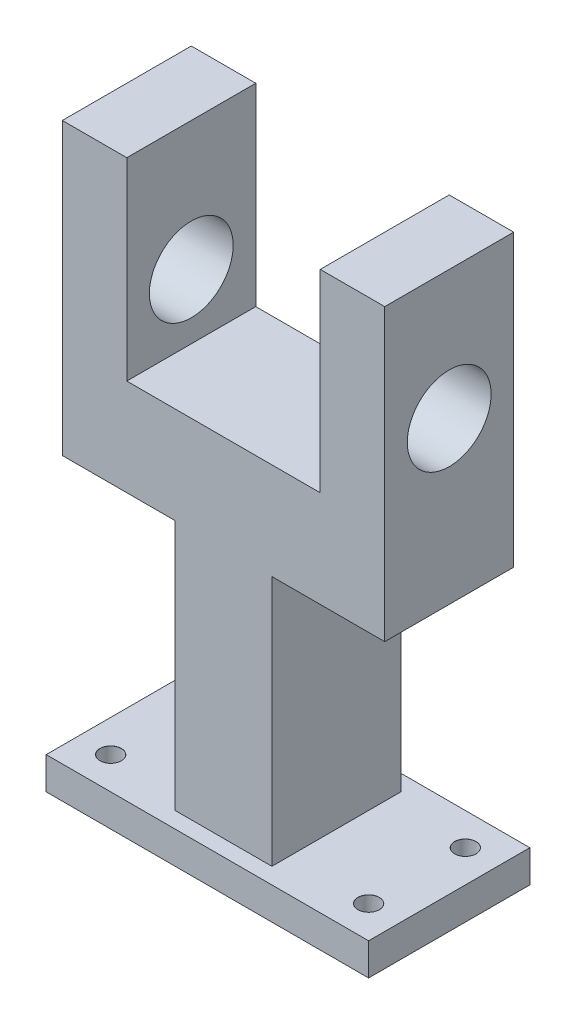
ISO-10303-21;
HEADER;
FILE_DESCRIPTION(('STEP AP214'),'2;1');
FILE_NAME('part.step','',(''),(''),'','','');
FILE_SCHEMA(('AUTOMOTIVE_DESIGN { 1 0 10303 214 1 1 1 1 }'));
ENDSEC;
DATA;
#1=APPLICATION_CONTEXT('core data for automotive mechanical design processes');
#2=APPLICATION_PROTOCOL_DEFINITION('international standard','automotive_design',2000,#1);
#3=PRODUCT_CONTEXT('',#1,'mechanical');
#4=PRODUCT('Part','Part','',(#3));
#5=PRODUCT_RELATED_PRODUCT_CATEGORY('part','',(#4));
#6=PRODUCT_DEFINITION_FORMATION('','',#4);
#7=PRODUCT_DEFINITION_CONTEXT('part definition',#1,'design');
#8=PRODUCT_DEFINITION('design','',#6,#7);
#9=PRODUCT_DEFINITION_SHAPE('','',#8);
#10=(LENGTH_UNIT() NAMED_UNIT(*) SI_UNIT(.MILLI.,.METRE.));
#11=(NAMED_UNIT(*) PLANE_ANGLE_UNIT() SI_UNIT($,.RADIAN.));
#12=(NAMED_UNIT(*) SI_UNIT($,.STERADIAN.) SOLID_ANGLE_UNIT());
#13=UNCERTAINTY_MEASURE_WITH_UNIT(LENGTH_MEASURE(1.E-05),#10,'distance_accuracy_value','');
#14=(GEOMETRIC_REPRESENTATION_CONTEXT(3) GLOBAL_UNCERTAINTY_ASSIGNED_CONTEXT((#13)) GLOBAL_UNIT_ASSIGNED_CONTEXT((#10,
#11,#12)) REPRESENTATION_CONTEXT('',''));
#15=CARTESIAN_POINT('',(0.,0.,0.));
#16=DIRECTION('',(0.,0.,1.));
#17=DIRECTION('',(1.,0.,0.));
#18=AXIS2_PLACEMENT_3D('',#15,#16,#17);
#19=CARTESIAN_POINT('',(0.,117.84,0.));
#20=DIRECTION('',(0.,-1.,0.));
#21=DIRECTION('',(0.,0.,-1.));
#22=AXIS2_PLACEMENT_3D('',#19,#20,#21);
#23=PLANE('',#22);
#24=DIRECTION('',(0.,0.,1.));
#25=VECTOR('',#24,1.);
#26=CARTESIAN_POINT('',(30.,117.84,-20.));
#27=LINE('',#26,#25);
#28=CARTESIAN_POINT('',(30.,117.84,-20.));
#29=VERTEX_POINT('',#28);
#30=CARTESIAN_POINT('',(30.,117.84,20.));
#31=VERTEX_POINT('',#30);
#32=EDGE_CURVE('E162',#29,#31,#27,.T.);
#33=ORIENTED_EDGE('',*,*,#32,.F.);
#34=DIRECTION('',(-1.,0.,0.));
#35=VECTOR('',#34,1.);
#36=CARTESIAN_POINT('',(-15.,117.84,-20.));
#37=LINE('',#36,#35);
#38=CARTESIAN_POINT('',(-30.,117.84,-20.));
#39=VERTEX_POINT('',#38);
#40=EDGE_CURVE('E183',#29,#39,#37,.T.);
#41=ORIENTED_EDGE('',*,*,#40,.T.);
#42=DIRECTION('',(0.,0.,-1.));
#43=VECTOR('',#42,1.);
#44=CARTESIAN_POINT('',(-30.,117.84,-20.));
#45=LINE('',#44,#43);
#46=CARTESIAN_POINT('',(-30.,117.84,20.));
#47=VERTEX_POINT('',#46);
#48=EDGE_CURVE('E63',#47,#39,#45,.T.);
#49=ORIENTED_EDGE('',*,*,#48,.F.);
#50=DIRECTION('',(1.,0.,0.));
#51=VECTOR('',#50,1.);
#52=CARTESIAN_POINT('',(-15.,117.84,20.));
#53=LINE('',#52,#51);
#54=EDGE_CURVE('E177',#47,#31,#53,.T.);
#55=ORIENTED_EDGE('',*,*,#54,.T.);
#56=EDGE_LOOP('',(#33,#41,#49,#55));
#57=FACE_BOUND('',#56,.T.);
#58=ADVANCED_FACE('F47',(#57),#23,.F.);
#59=CARTESIAN_POINT('',(0.,10.,0.));
#60=DIRECTION('',(0.,1.,0.));
#61=DIRECTION('',(0.,0.,1.));
#62=AXIS2_PLACEMENT_3D('',#59,#60,#61);
#63=PLANE('',#62);
#64=CARTESIAN_POINT('',(-40.,10.,-15.));
#65=DIRECTION('',(0.,1.,0.));
#66=DIRECTION('',(0.,0.,1.));
#67=AXIS2_PLACEMENT_3D('',#64,#65,#66);
#68=CIRCLE('',#67,3.325);
#69=CARTESIAN_POINT('',(-40.,10.,-11.675));
#70=VERTEX_POINT('',#69);
#71=EDGE_CURVE('E208',#70,#70,#68,.T.);
#72=ORIENTED_EDGE('',*,*,#71,.F.);
#73=EDGE_LOOP('',(#72));
#74=FACE_BOUND('',#73,.T.);
#75=CARTESIAN_POINT('',(40.,10.,-15.));
#76=DIRECTION('',(0.,1.,0.));
#77=DIRECTION('',(0.,0.,1.));
#78=AXIS2_PLACEMENT_3D('',#75,#76,#77);
#79=CIRCLE('',#78,3.325);
#80=CARTESIAN_POINT('',(40.,10.,-11.675));
#81=VERTEX_POINT('',#80);
#82=EDGE_CURVE('E217',#81,#81,#79,.T.);
#83=ORIENTED_EDGE('',*,*,#82,.F.);
#84=EDGE_LOOP('',(#83));
#85=FACE_BOUND('',#84,.T.);
#86=CARTESIAN_POINT('',(-40.,10.,15.));
#87=DIRECTION('',(0.,1.,0.));
#88=DIRECTION('',(0.,0.,1.));
#89=AXIS2_PLACEMENT_3D('',#86,#87,#88);
#90=CIRCLE('',#89,3.325);
#91=CARTESIAN_POINT('',(-40.,10.,18.325));
#92=VERTEX_POINT('',#91);
#93=EDGE_CURVE('E226',#92,#92,#90,.T.);
#94=ORIENTED_EDGE('',*,*,#93,.F.);
#95=EDGE_LOOP('',(#94));
#96=FACE_BOUND('',#95,.T.);
#97=CARTESIAN_POINT('',(40.,10.,15.));
#98=DIRECTION('',(0.,1.,0.));
#99=DIRECTION('',(0.,0.,1.));
#100=AXIS2_PLACEMENT_3D('',#97,#98,#99);
#101=CIRCLE('',#100,3.325);
#102=CARTESIAN_POINT('',(40.,10.,18.325));
#103=VERTEX_POINT('',#102);
#104=EDGE_CURVE('E235',#103,#103,#101,.T.);
#105=ORIENTED_EDGE('',*,*,#104,.F.);
#106=EDGE_LOOP('',(#105));
#107=FACE_BOUND('',#106,.T.);
#108=DIRECTION('',(0.,0.,-1.));
#109=VECTOR('',#108,1.);
#110=CARTESIAN_POINT('',(50.,10.,-25.));
#111=LINE('',#110,#109);
#112=CARTESIAN_POINT('',(50.,10.,25.));
#113=VERTEX_POINT('',#112);
#114=CARTESIAN_POINT('',(50.,10.,-25.));
#115=VERTEX_POINT('',#114);
#116=EDGE_CURVE('E245',#113,#115,#111,.T.);
#117=ORIENTED_EDGE('',*,*,#116,.T.);
#118=DIRECTION('',(-1.,0.,0.));
#119=VECTOR('',#118,1.);
#120=CARTESIAN_POINT('',(-50.,10.,-25.));
#121=LINE('',#120,#119);
#122=CARTESIAN_POINT('',(-50.,10.,-25.));
#123=VERTEX_POINT('',#122);
#124=EDGE_CURVE('E248',#115,#123,#121,.T.);
#125=ORIENTED_EDGE('',*,*,#124,.T.);
#126=DIRECTION('',(0.,0.,1.));
#127=VECTOR('',#126,1.);
#128=CARTESIAN_POINT('',(-50.,10.,-25.));
#129=LINE('',#128,#127);
#130=CARTESIAN_POINT('',(-50.,10.,25.));
#131=VERTEX_POINT('',#130);
#132=EDGE_CURVE('E251',#123,#131,#129,.T.);
#133=ORIENTED_EDGE('',*,*,#132,.T.);
#134=DIRECTION('',(1.,0.,0.));
#135=VECTOR('',#134,1.);
#136=CARTESIAN_POINT('',(-50.,10.,25.));
#137=LINE('',#136,#135);
#138=EDGE_CURVE('E253',#131,#113,#137,.T.);
#139=ORIENTED_EDGE('',*,*,#138,.T.);
#140=EDGE_LOOP('',(#117,#125,#133,#139));
#141=FACE_BOUND('',#140,.T.);
#142=DIRECTION('',(-1.,0.,0.));
#143=VECTOR('',#142,1.);
#144=CARTESIAN_POINT('',(-15.,10.,-20.));
#145=LINE('',#144,#143);
#146=CARTESIAN_POINT('',(15.,10.,-20.));
#147=VERTEX_POINT('',#146);
#148=CARTESIAN_POINT('',(-15.,10.,-20.));
#149=VERTEX_POINT('',#148);
#150=EDGE_CURVE('E194',#147,#149,#145,.T.);
#151=ORIENTED_EDGE('',*,*,#150,.F.);
#152=DIRECTION('',(0.,0.,-1.));
#153=VECTOR('',#152,1.);
#154=CARTESIAN_POINT('',(15.,10.,20.));
#155=LINE('',#154,#153);
#156=CARTESIAN_POINT('',(15.,10.,20.));
#157=VERTEX_POINT('',#156);
#158=EDGE_CURVE('E191',#157,#147,#155,.T.);
#159=ORIENTED_EDGE('',*,*,#158,.F.);
#160=DIRECTION('',(1.,0.,0.));
#161=VECTOR('',#160,1.);
#162=CARTESIAN_POINT('',(-15.,10.,20.));
#163=LINE('',#162,#161);
#164=CARTESIAN_POINT('',(-15.,10.,20.));
#165=VERTEX_POINT('',#164);
#166=EDGE_CURVE('E187',#165,#157,#163,.T.);
#167=ORIENTED_EDGE('',*,*,#166,.F.);
#168=DIRECTION('',(0.,0.,1.));
#169=VECTOR('',#168,1.);
#170=CARTESIAN_POINT('',(-15.,10.,20.));
#171=LINE('',#170,#169);
#172=EDGE_CURVE('E198',#149,#165,#171,.T.);
#173=ORIENTED_EDGE('',*,*,#172,.F.);
#174=EDGE_LOOP('',(#151,#159,#167,#173));
#175=FACE_BOUND('',#174,.T.);
#176=ADVANCED_FACE('F288',(#74,#85,#96,#107,#141,#175),#63,.T.);
#177=CARTESIAN_POINT('',(50.,10.,-25.));
#178=DIRECTION('',(-1.,0.,0.));
#179=DIRECTION('',(0.,0.,1.));
#180=AXIS2_PLACEMENT_3D('',#177,#178,#179);
#181=PLANE('',#180);
#182=DIRECTION('',(0.,0.,-1.));
#183=VECTOR('',#182,1.);
#184=CARTESIAN_POINT('',(50.,0.,-25.));
#185=LINE('',#184,#183);
#186=CARTESIAN_POINT('',(50.,0.,25.));
#187=VERTEX_POINT('',#186);
#188=CARTESIAN_POINT('',(50.,0.,-25.));
#189=VERTEX_POINT('',#188);
#190=EDGE_CURVE('E244',#187,#189,#185,.T.);
#191=ORIENTED_EDGE('',*,*,#190,.T.);
#192=DIRECTION('',(0.,-1.,0.));
#193=VECTOR('',#192,1.);
#194=CARTESIAN_POINT('',(50.,10.,-25.));
#195=LINE('',#194,#193);
#196=EDGE_CURVE('E11',#115,#189,#195,.T.);
#197=ORIENTED_EDGE('',*,*,#196,.F.);
#198=ORIENTED_EDGE('',*,*,#116,.F.);
#199=DIRECTION('',(0.,-1.,0.));
#200=VECTOR('',#199,1.);
#201=CARTESIAN_POINT('',(50.,10.,25.));
#202=LINE('',#201,#200);
#203=EDGE_CURVE('E255',#113,#187,#202,.T.);
#204=ORIENTED_EDGE('',*,*,#203,.T.);
#205=EDGE_LOOP('',(#191,#197,#198,#204));
#206=FACE_BOUND('',#205,.T.);
#207=ADVANCED_FACE('F49',(#206),#181,.F.);
#208=CARTESIAN_POINT('',(-50.,10.,-25.));
#209=DIRECTION('',(0.,0.,1.));
#210=DIRECTION('',(1.,0.,0.));
#211=AXIS2_PLACEMENT_3D('',#208,#209,#210);
#212=PLANE('',#211);
#213=DIRECTION('',(-1.,0.,0.));
#214=VECTOR('',#213,1.);
#215=CARTESIAN_POINT('',(-50.,0.,-25.));
#216=LINE('',#215,#214);
#217=CARTESIAN_POINT('',(-50.,0.,-25.));
#218=VERTEX_POINT('',#217);
#219=EDGE_CURVE('E258',#189,#218,#216,.T.);
#220=ORIENTED_EDGE('',*,*,#219,.T.);
#221=DIRECTION('',(0.,-1.,0.));
#222=VECTOR('',#221,1.);
#223=CARTESIAN_POINT('',(-50.,10.,-25.));
#224=LINE('',#223,#222);
#225=EDGE_CURVE('E56',#123,#218,#224,.T.);
#226=ORIENTED_EDGE('',*,*,#225,.F.);
#227=ORIENTED_EDGE('',*,*,#124,.F.);
#228=ORIENTED_EDGE('',*,*,#196,.T.);
#229=EDGE_LOOP('',(#220,#226,#227,#228));
#230=FACE_BOUND('',#229,.T.);
#231=ADVANCED_FACE('F290',(#230),#212,.F.);
#232=CARTESIAN_POINT('',(-50.,10.,-25.));
#233=DIRECTION('',(1.,0.,0.));
#234=DIRECTION('',(0.,0.,-1.));
#235=AXIS2_PLACEMENT_3D('',#232,#233,#234);
#236=PLANE('',#235);
#237=DIRECTION('',(0.,0.,1.));
#238=VECTOR('',#237,1.);
#239=CARTESIAN_POINT('',(-50.,0.,-25.));
#240=LINE('',#239,#238);
#241=CARTESIAN_POINT('',(-50.,0.,25.));
#242=VERTEX_POINT('',#241);
#243=EDGE_CURVE('E260',#218,#242,#240,.T.);
#244=ORIENTED_EDGE('',*,*,#243,.T.);
#245=DIRECTION('',(0.,-1.,0.));
#246=VECTOR('',#245,1.);
#247=CARTESIAN_POINT('',(-50.,10.,25.));
#248=LINE('',#247,#246);
#249=EDGE_CURVE('E265',#131,#242,#248,.T.);
#250=ORIENTED_EDGE('',*,*,#249,.F.);
#251=ORIENTED_EDGE('',*,*,#132,.F.);
#252=ORIENTED_EDGE('',*,*,#225,.T.);
#253=EDGE_LOOP('',(#244,#250,#251,#252));
#254=FACE_BOUND('',#253,.T.);
#255=ADVANCED_FACE('F273',(#254),#236,.F.);
#256=CARTESIAN_POINT('',(-50.,10.,25.));
#257=DIRECTION('',(0.,0.,-1.));
#258=DIRECTION('',(-1.,0.,0.));
#259=AXIS2_PLACEMENT_3D('',#256,#257,#258);
#260=PLANE('',#259);
#261=DIRECTION('',(1.,0.,0.));
#262=VECTOR('',#261,1.);
#263=CARTESIAN_POINT('',(-50.,0.,25.));
#264=LINE('',#263,#262);
#265=EDGE_CURVE('E249',#242,#187,#264,.T.);
#266=ORIENTED_EDGE('',*,*,#265,.T.);
#267=ORIENTED_EDGE('',*,*,#203,.F.);
#268=ORIENTED_EDGE('',*,*,#138,.F.);
#269=ORIENTED_EDGE('',*,*,#249,.T.);
#270=EDGE_LOOP('',(#266,#267,#268,#269));
#271=FACE_BOUND('',#270,.T.);
#272=ADVANCED_FACE('F282',(#271),#260,.F.);
#273=CARTESIAN_POINT('',(0.,0.,0.));
#274=DIRECTION('',(0.,1.,0.));
#275=DIRECTION('',(0.,0.,1.));
#276=AXIS2_PLACEMENT_3D('',#273,#274,#275);
#277=PLANE('',#276);
#278=CARTESIAN_POINT('',(-40.,0.,-15.));
#279=DIRECTION('',(0.,1.,0.));
#280=DIRECTION('',(0.,0.,1.));
#281=AXIS2_PLACEMENT_3D('',#278,#279,#280);
#282=CIRCLE('',#281,3.3);
#283=CARTESIAN_POINT('',(-40.,0.,-11.7));
#284=VERTEX_POINT('',#283);
#285=EDGE_CURVE('E214',#284,#284,#282,.T.);
#286=ORIENTED_EDGE('',*,*,#285,.T.);
#287=EDGE_LOOP('',(#286));
#288=FACE_BOUND('',#287,.T.);
#289=CARTESIAN_POINT('',(40.,0.,-15.));
#290=DIRECTION('',(0.,1.,0.));
#291=DIRECTION('',(0.,0.,1.));
#292=AXIS2_PLACEMENT_3D('',#289,#290,#291);
#293=CIRCLE('',#292,3.3);
#294=CARTESIAN_POINT('',(40.,0.,-11.7));
#295=VERTEX_POINT('',#294);
#296=EDGE_CURVE('E223',#295,#295,#293,.T.);
#297=ORIENTED_EDGE('',*,*,#296,.T.);
#298=EDGE_LOOP('',(#297));
#299=FACE_BOUND('',#298,.T.);
#300=CARTESIAN_POINT('',(-40.,0.,15.));
#301=DIRECTION('',(0.,1.,0.));
#302=DIRECTION('',(0.,0.,1.));
#303=AXIS2_PLACEMENT_3D('',#300,#301,#302);
#304=CIRCLE('',#303,3.3);
#305=CARTESIAN_POINT('',(-40.,0.,18.3));
#306=VERTEX_POINT('',#305);
#307=EDGE_CURVE('E232',#306,#306,#304,.T.);
#308=ORIENTED_EDGE('',*,*,#307,.T.);
#309=EDGE_LOOP('',(#308));
#310=FACE_BOUND('',#309,.T.);
#311=CARTESIAN_POINT('',(40.,0.,15.));
#312=DIRECTION('',(0.,1.,0.));
#313=DIRECTION('',(0.,0.,1.));
#314=AXIS2_PLACEMENT_3D('',#311,#312,#313);
#315=CIRCLE('',#314,3.3);
#316=CARTESIAN_POINT('',(40.,0.,18.3));
#317=VERTEX_POINT('',#316);
#318=EDGE_CURVE('E241',#317,#317,#315,.T.);
#319=ORIENTED_EDGE('',*,*,#318,.T.);
#320=EDGE_LOOP('',(#319));
#321=FACE_BOUND('',#320,.T.);
#322=ORIENTED_EDGE('',*,*,#190,.F.);
#323=ORIENTED_EDGE('',*,*,#265,.F.);
#324=ORIENTED_EDGE('',*,*,#243,.F.);
#325=ORIENTED_EDGE('',*,*,#219,.F.);
#326=EDGE_LOOP('',(#322,#323,#324,#325));
#327=FACE_BOUND('',#326,.T.);
#328=ADVANCED_FACE('F279',(#288,#299,#310,#321,#327),#277,.F.);
#329=CARTESIAN_POINT('',(40.,10.,15.));
#330=DIRECTION('',(0.,1.,0.));
#331=DIRECTION('',(0.,0.,1.));
#332=AXIS2_PLACEMENT_3D('',#329,#330,#331);
#333=CYLINDRICAL_SURFACE('',#332,3.3);
#334=ORIENTED_EDGE('',*,*,#318,.F.);
#335=EDGE_LOOP('',(#334));
#336=FACE_BOUND('',#335,.T.);
#337=CARTESIAN_POINT('',(40.,9.97902250922057,15.));
#338=DIRECTION('',(0.,1.,0.));
#339=DIRECTION('',(0.,0.,1.));
#340=AXIS2_PLACEMENT_3D('',#337,#338,#339);
#341=CIRCLE('',#340,3.3);
#342=CARTESIAN_POINT('',(40.,9.97902250922057,18.3));
#343=VERTEX_POINT('',#342);
#344=EDGE_CURVE('E238',#343,#343,#341,.T.);
#345=ORIENTED_EDGE('',*,*,#344,.T.);
#346=EDGE_LOOP('',(#345));
#347=FACE_BOUND('',#346,.T.);
#348=ADVANCED_FACE('F350',(#336,#347),#333,.F.);
#349=CARTESIAN_POINT('',(40.,10.,15.));
#350=DIRECTION('',(0.,1.,0.));
#351=DIRECTION('',(0.,0.,1.));
#352=AXIS2_PLACEMENT_3D('',#349,#350,#351);
#353=CONICAL_SURFACE('',#352,3.325,0.872664625997268);
#354=ORIENTED_EDGE('',*,*,#344,.F.);
#355=EDGE_LOOP('',(#354));
#356=FACE_BOUND('',#355,.T.);
#357=ORIENTED_EDGE('',*,*,#104,.T.);
#358=EDGE_LOOP('',(#357));
#359=FACE_BOUND('',#358,.T.);
#360=ADVANCED_FACE('F346',(#356,#359),#353,.F.);
#361=CARTESIAN_POINT('',(-40.,10.,15.));
#362=DIRECTION('',(0.,1.,0.));
#363=DIRECTION('',(0.,0.,1.));
#364=AXIS2_PLACEMENT_3D('',#361,#362,#363);
#365=CYLINDRICAL_SURFACE('',#364,3.3);
#366=ORIENTED_EDGE('',*,*,#307,.F.);
#367=EDGE_LOOP('',(#366));
#368=FACE_BOUND('',#367,.T.);
#369=CARTESIAN_POINT('',(-40.,9.97902250922057,15.));
#370=DIRECTION('',(0.,1.,0.));
#371=DIRECTION('',(0.,0.,1.));
#372=AXIS2_PLACEMENT_3D('',#369,#370,#371);
#373=CIRCLE('',#372,3.3);
#374=CARTESIAN_POINT('',(-40.,9.97902250922057,18.3));
#375=VERTEX_POINT('',#374);
#376=EDGE_CURVE('E229',#375,#375,#373,.T.);
#377=ORIENTED_EDGE('',*,*,#376,.T.);
#378=EDGE_LOOP('',(#377));
#379=FACE_BOUND('',#378,.T.);
#380=ADVANCED_FACE('F342',(#368,#379),#365,.F.);
#381=CARTESIAN_POINT('',(-40.,10.,15.));
#382=DIRECTION('',(0.,1.,0.));
#383=DIRECTION('',(0.,0.,1.));
#384=AXIS2_PLACEMENT_3D('',#381,#382,#383);
#385=CONICAL_SURFACE('',#384,3.325,0.872664625997268);
#386=ORIENTED_EDGE('',*,*,#376,.F.);
#387=EDGE_LOOP('',(#386));
#388=FACE_BOUND('',#387,.T.);
#389=ORIENTED_EDGE('',*,*,#93,.T.);
#390=EDGE_LOOP('',(#389));
#391=FACE_BOUND('',#390,.T.);
#392=ADVANCED_FACE('F338',(#388,#391),#385,.F.);
#393=CARTESIAN_POINT('',(40.,10.,-15.));
#394=DIRECTION('',(0.,1.,0.));
#395=DIRECTION('',(0.,0.,1.));
#396=AXIS2_PLACEMENT_3D('',#393,#394,#395);
#397=CYLINDRICAL_SURFACE('',#396,3.3);
#398=ORIENTED_EDGE('',*,*,#296,.F.);
#399=EDGE_LOOP('',(#398));
#400=FACE_BOUND('',#399,.T.);
#401=CARTESIAN_POINT('',(40.,9.97902250922057,-15.));
#402=DIRECTION('',(0.,1.,0.));
#403=DIRECTION('',(0.,0.,1.));
#404=AXIS2_PLACEMENT_3D('',#401,#402,#403);
#405=CIRCLE('',#404,3.3);
#406=CARTESIAN_POINT('',(40.,9.97902250922057,-11.7));
#407=VERTEX_POINT('',#406);
#408=EDGE_CURVE('E220',#407,#407,#405,.T.);
#409=ORIENTED_EDGE('',*,*,#408,.T.);
#410=EDGE_LOOP('',(#409));
#411=FACE_BOUND('',#410,.T.);
#412=ADVANCED_FACE('F334',(#400,#411),#397,.F.);
#413=CARTESIAN_POINT('',(40.,10.,-15.));
#414=DIRECTION('',(0.,1.,0.));
#415=DIRECTION('',(0.,0.,1.));
#416=AXIS2_PLACEMENT_3D('',#413,#414,#415);
#417=CONICAL_SURFACE('',#416,3.325,0.872664625997268);
#418=ORIENTED_EDGE('',*,*,#408,.F.);
#419=EDGE_LOOP('',(#418));
#420=FACE_BOUND('',#419,.T.);
#421=ORIENTED_EDGE('',*,*,#82,.T.);
#422=EDGE_LOOP('',(#421));
#423=FACE_BOUND('',#422,.T.);
#424=ADVANCED_FACE('F330',(#420,#423),#417,.F.);
#425=CARTESIAN_POINT('',(-40.,10.,-15.));
#426=DIRECTION('',(0.,1.,0.));
#427=DIRECTION('',(0.,0.,1.));
#428=AXIS2_PLACEMENT_3D('',#425,#426,#427);
#429=CYLINDRICAL_SURFACE('',#428,3.3);
#430=ORIENTED_EDGE('',*,*,#285,.F.);
#431=EDGE_LOOP('',(#430));
#432=FACE_BOUND('',#431,.T.);
#433=CARTESIAN_POINT('',(-40.,9.97902250922057,-15.));
#434=DIRECTION('',(0.,1.,0.));
#435=DIRECTION('',(0.,0.,1.));
#436=AXIS2_PLACEMENT_3D('',#433,#434,#435);
#437=CIRCLE('',#436,3.3);
#438=CARTESIAN_POINT('',(-40.,9.97902250922057,-11.7));
#439=VERTEX_POINT('',#438);
#440=EDGE_CURVE('E211',#439,#439,#437,.T.);
#441=ORIENTED_EDGE('',*,*,#440,.T.);
#442=EDGE_LOOP('',(#441));
#443=FACE_BOUND('',#442,.T.);
#444=ADVANCED_FACE('F326',(#432,#443),#429,.F.);
#445=CARTESIAN_POINT('',(-40.,10.,-15.));
#446=DIRECTION('',(0.,1.,0.));
#447=DIRECTION('',(0.,0.,1.));
#448=AXIS2_PLACEMENT_3D('',#445,#446,#447);
#449=CONICAL_SURFACE('',#448,3.325,0.872664625997268);
#450=ORIENTED_EDGE('',*,*,#440,.F.);
#451=EDGE_LOOP('',(#450));
#452=FACE_BOUND('',#451,.T.);
#453=ORIENTED_EDGE('',*,*,#71,.T.);
#454=EDGE_LOOP('',(#453));
#455=FACE_BOUND('',#454,.T.);
#456=ADVANCED_FACE('F322',(#452,#455),#449,.F.);
#457=CARTESIAN_POINT('',(15.,117.84,20.));
#458=DIRECTION('',(-1.,0.,0.));
#459=DIRECTION('',(0.,0.,1.));
#460=AXIS2_PLACEMENT_3D('',#457,#458,#459);
#461=PLANE('',#460);
#462=DIRECTION('',(0.,-1.,0.));
#463=VECTOR('',#462,1.);
#464=CARTESIAN_POINT('',(15.,117.84,-20.));
#465=LINE('',#464,#463);
#466=CARTESIAN_POINT('',(15.,87.84,-20.));
#467=VERTEX_POINT('',#466);
#468=EDGE_CURVE('E206',#467,#147,#465,.T.);
#469=ORIENTED_EDGE('',*,*,#468,.F.);
#470=DIRECTION('',(0.,0.,1.));
#471=VECTOR('',#470,1.);
#472=CARTESIAN_POINT('',(15.,87.84,20.));
#473=LINE('',#472,#471);
#474=CARTESIAN_POINT('',(15.,87.84,20.));
#475=VERTEX_POINT('',#474);
#476=EDGE_CURVE('E195',#467,#475,#473,.T.);
#477=ORIENTED_EDGE('',*,*,#476,.T.);
#478=DIRECTION('',(0.,-1.,0.));
#479=VECTOR('',#478,1.);
#480=CARTESIAN_POINT('',(15.,117.84,20.));
#481=LINE('',#480,#479);
#482=EDGE_CURVE('E182',#475,#157,#481,.T.);
#483=ORIENTED_EDGE('',*,*,#482,.T.);
#484=ORIENTED_EDGE('',*,*,#158,.T.);
#485=EDGE_LOOP('',(#469,#477,#483,#484));
#486=FACE_BOUND('',#485,.T.);
#487=ADVANCED_FACE('F318',(#486),#461,.F.);
#488=CARTESIAN_POINT('',(-15.,117.84,-20.));
#489=DIRECTION('',(0.,0.,1.));
#490=DIRECTION('',(1.,0.,0.));
#491=AXIS2_PLACEMENT_3D('',#488,#489,#490);
#492=PLANE('',#491);
#493=DIRECTION('',(0.,-1.,0.));
#494=VECTOR('',#493,1.);
#495=CARTESIAN_POINT('',(-15.,117.84,-20.));
#496=LINE('',#495,#494);
#497=CARTESIAN_POINT('',(-15.,87.84,-20.));
#498=VERTEX_POINT('',#497);
#499=EDGE_CURVE('E204',#498,#149,#496,.T.);
#500=ORIENTED_EDGE('',*,*,#499,.F.);
#501=DIRECTION('',(1.,0.,0.));
#502=VECTOR('',#501,1.);
#503=CARTESIAN_POINT('',(-50.,87.84,-20.));
#504=LINE('',#503,#502);
#505=CARTESIAN_POINT('',(-50.,87.84,-20.));
#506=VERTEX_POINT('',#505);
#507=EDGE_CURVE('E71',#506,#498,#504,.T.);
#508=ORIENTED_EDGE('',*,*,#507,.F.);
#509=DIRECTION('',(0.,1.,0.));
#510=VECTOR('',#509,1.);
#511=CARTESIAN_POINT('',(-50.,117.84,-20.));
#512=LINE('',#511,#510);
#513=CARTESIAN_POINT('',(-50.,177.84,-20.));
#514=VERTEX_POINT('',#513);
#515=EDGE_CURVE('E696',#506,#514,#512,.T.);
#516=ORIENTED_EDGE('',*,*,#515,.T.);
#517=DIRECTION('',(-1.,0.,0.));
#518=VECTOR('',#517,1.);
#519=CARTESIAN_POINT('',(-50.,177.84,-20.));
#520=LINE('',#519,#518);
#521=CARTESIAN_POINT('',(-30.,177.84,-20.));
#522=VERTEX_POINT('',#521);
#523=EDGE_CURVE('E674',#522,#514,#520,.T.);
#524=ORIENTED_EDGE('',*,*,#523,.F.);
#525=DIRECTION('',(0.,-1.,0.));
#526=VECTOR('',#525,1.);
#527=CARTESIAN_POINT('',(-30.,177.84,-20.));
#528=LINE('',#527,#526);
#529=EDGE_CURVE('E677',#522,#39,#528,.T.);
#530=ORIENTED_EDGE('',*,*,#529,.T.);
#531=ORIENTED_EDGE('',*,*,#40,.F.);
#532=DIRECTION('',(0.,-1.,0.));
#533=VECTOR('',#532,1.);
#534=CARTESIAN_POINT('',(30.,177.84,-20.));
#535=LINE('',#534,#533);
#536=CARTESIAN_POINT('',(30.,177.84,-20.));
#537=VERTEX_POINT('',#536);
#538=EDGE_CURVE('E169',#537,#29,#535,.T.);
#539=ORIENTED_EDGE('',*,*,#538,.F.);
#540=DIRECTION('',(-1.,0.,0.));
#541=VECTOR('',#540,1.);
#542=CARTESIAN_POINT('',(50.,177.84,-20.));
#543=LINE('',#542,#541);
#544=CARTESIAN_POINT('',(50.,177.84,-20.));
#545=VERTEX_POINT('',#544);
#546=EDGE_CURVE('E663',#545,#537,#543,.T.);
#547=ORIENTED_EDGE('',*,*,#546,.F.);
#548=DIRECTION('',(0.,1.,0.));
#549=VECTOR('',#548,1.);
#550=CARTESIAN_POINT('',(50.,117.84,-20.));
#551=LINE('',#550,#549);
#552=CARTESIAN_POINT('',(50.,87.84,-20.));
#553=VERTEX_POINT('',#552);
#554=EDGE_CURVE('E689',#553,#545,#551,.T.);
#555=ORIENTED_EDGE('',*,*,#554,.F.);
#556=EDGE_CURVE('E701',#467,#553,#504,.T.);
#557=ORIENTED_EDGE('',*,*,#556,.F.);
#558=ORIENTED_EDGE('',*,*,#468,.T.);
#559=ORIENTED_EDGE('',*,*,#150,.T.);
#560=EDGE_LOOP('',(#500,#508,#516,#524,#530,#531,#539,#547,#555,#557,#558,#559));
#561=FACE_BOUND('',#560,.T.);
#562=ADVANCED_FACE('F314',(#561),#492,.F.);
#563=CARTESIAN_POINT('',(-15.,117.84,20.));
#564=DIRECTION('',(1.,0.,0.));
#565=DIRECTION('',(0.,0.,-1.));
#566=AXIS2_PLACEMENT_3D('',#563,#564,#565);
#567=PLANE('',#566);
#568=DIRECTION('',(0.,-1.,0.));
#569=VECTOR('',#568,1.);
#570=CARTESIAN_POINT('',(-15.,117.84,20.));
#571=LINE('',#570,#569);
#572=CARTESIAN_POINT('',(-15.,87.84,20.));
#573=VERTEX_POINT('',#572);
#574=EDGE_CURVE('E185',#573,#165,#571,.T.);
#575=ORIENTED_EDGE('',*,*,#574,.F.);
#576=DIRECTION('',(0.,0.,-1.));
#577=VECTOR('',#576,1.);
#578=CARTESIAN_POINT('',(-15.,87.84,20.));
#579=LINE('',#578,#577);
#580=EDGE_CURVE('E700',#573,#498,#579,.T.);
#581=ORIENTED_EDGE('',*,*,#580,.T.);
#582=ORIENTED_EDGE('',*,*,#499,.T.);
#583=ORIENTED_EDGE('',*,*,#172,.T.);
#584=EDGE_LOOP('',(#575,#581,#582,#583));
#585=FACE_BOUND('',#584,.T.);
#586=ADVANCED_FACE('F311',(#585),#567,.F.);
#587=CARTESIAN_POINT('',(-15.,117.84,20.));
#588=DIRECTION('',(0.,0.,-1.));
#589=DIRECTION('',(-1.,0.,0.));
#590=AXIS2_PLACEMENT_3D('',#587,#588,#589);
#591=PLANE('',#590);
#592=ORIENTED_EDGE('',*,*,#482,.F.);
#593=DIRECTION('',(1.,0.,0.));
#594=VECTOR('',#593,1.);
#595=CARTESIAN_POINT('',(-50.,87.84,20.));
#596=LINE('',#595,#594);
#597=CARTESIAN_POINT('',(50.,87.84,20.));
#598=VERTEX_POINT('',#597);
#599=EDGE_CURVE('E698',#475,#598,#596,.T.);
#600=ORIENTED_EDGE('',*,*,#599,.T.);
#601=DIRECTION('',(0.,-1.,0.));
#602=VECTOR('',#601,1.);
#603=CARTESIAN_POINT('',(50.,117.84,20.));
#604=LINE('',#603,#602);
#605=CARTESIAN_POINT('',(50.,177.84,20.));
#606=VERTEX_POINT('',#605);
#607=EDGE_CURVE('E683',#606,#598,#604,.T.);
#608=ORIENTED_EDGE('',*,*,#607,.F.);
#609=DIRECTION('',(1.,0.,0.));
#610=VECTOR('',#609,1.);
#611=CARTESIAN_POINT('',(50.,177.84,20.));
#612=LINE('',#611,#610);
#613=CARTESIAN_POINT('',(30.,177.84,20.));
#614=VERTEX_POINT('',#613);
#615=EDGE_CURVE('E180',#614,#606,#612,.T.);
#616=ORIENTED_EDGE('',*,*,#615,.F.);
#617=DIRECTION('',(0.,-1.,0.));
#618=VECTOR('',#617,1.);
#619=CARTESIAN_POINT('',(30.,177.84,20.));
#620=LINE('',#619,#618);
#621=EDGE_CURVE('E166',#614,#31,#620,.T.);
#622=ORIENTED_EDGE('',*,*,#621,.T.);
#623=ORIENTED_EDGE('',*,*,#54,.F.);
#624=DIRECTION('',(0.,-1.,0.));
#625=VECTOR('',#624,1.);
#626=CARTESIAN_POINT('',(-30.,177.84,20.));
#627=LINE('',#626,#625);
#628=CARTESIAN_POINT('',(-30.,177.84,20.));
#629=VERTEX_POINT('',#628);
#630=EDGE_CURVE('E681',#629,#47,#627,.T.);
#631=ORIENTED_EDGE('',*,*,#630,.F.);
#632=DIRECTION('',(1.,0.,0.));
#633=VECTOR('',#632,1.);
#634=CARTESIAN_POINT('',(-50.,177.84,20.));
#635=LINE('',#634,#633);
#636=CARTESIAN_POINT('',(-50.,177.84,20.));
#637=VERTEX_POINT('',#636);
#638=EDGE_CURVE('E670',#637,#629,#635,.T.);
#639=ORIENTED_EDGE('',*,*,#638,.F.);
#640=DIRECTION('',(0.,-1.,0.));
#641=VECTOR('',#640,1.);
#642=CARTESIAN_POINT('',(-50.,117.84,20.));
#643=LINE('',#642,#641);
#644=CARTESIAN_POINT('',(-50.,87.84,20.));
#645=VERTEX_POINT('',#644);
#646=EDGE_CURVE('E691',#637,#645,#643,.T.);
#647=ORIENTED_EDGE('',*,*,#646,.T.);
#648=EDGE_CURVE('E702',#645,#573,#596,.T.);
#649=ORIENTED_EDGE('',*,*,#648,.T.);
#650=ORIENTED_EDGE('',*,*,#574,.T.);
#651=ORIENTED_EDGE('',*,*,#166,.T.);
#652=EDGE_LOOP('',(#592,#600,#608,#616,#622,#623,#631,#639,#647,#649,#650,#651));
#653=FACE_BOUND('',#652,.T.);
#654=ADVANCED_FACE('F175',(#653),#591,.F.);
#655=CARTESIAN_POINT('',(-50.,0.,0.));
#656=DIRECTION('',(1.,0.,0.));
#657=DIRECTION('',(0.,0.,-1.));
#658=AXIS2_PLACEMENT_3D('',#655,#656,#657);
#659=PLANE('',#658);
#660=CARTESIAN_POINT('',(-50.,137.84,0.));
#661=DIRECTION('',(-1.,0.,0.));
#662=DIRECTION('',(0.,0.,1.));
#663=AXIS2_PLACEMENT_3D('',#660,#661,#662);
#664=CIRCLE('',#663,13.);
#665=CARTESIAN_POINT('',(-50.,137.84,13.));
#666=VERTEX_POINT('',#665);
#667=EDGE_CURVE('E649',#666,#666,#664,.T.);
#668=ORIENTED_EDGE('',*,*,#667,.F.);
#669=EDGE_LOOP('',(#668));
#670=FACE_BOUND('',#669,.T.);
#671=ORIENTED_EDGE('',*,*,#646,.F.);
#672=DIRECTION('',(0.,0.,1.));
#673=VECTOR('',#672,1.);
#674=CARTESIAN_POINT('',(-50.,177.84,-20.));
#675=LINE('',#674,#673);
#676=EDGE_CURVE('E667',#514,#637,#675,.T.);
#677=ORIENTED_EDGE('',*,*,#676,.F.);
#678=ORIENTED_EDGE('',*,*,#515,.F.);
#679=DIRECTION('',(0.,0.,-1.));
#680=VECTOR('',#679,1.);
#681=CARTESIAN_POINT('',(-50.,87.84,20.));
#682=LINE('',#681,#680);
#683=EDGE_CURVE('E694',#645,#506,#682,.T.);
#684=ORIENTED_EDGE('',*,*,#683,.F.);
#685=EDGE_LOOP('',(#671,#677,#678,#684));
#686=FACE_BOUND('',#685,.T.);
#687=ADVANCED_FACE('F310',(#670,#686),#659,.F.);
#688=CARTESIAN_POINT('',(-50.,87.84,20.));
#689=DIRECTION('',(0.,-1.,0.));
#690=DIRECTION('',(0.,0.,-1.));
#691=AXIS2_PLACEMENT_3D('',#688,#689,#690);
#692=PLANE('',#691);
#693=ORIENTED_EDGE('',*,*,#580,.F.);
#694=ORIENTED_EDGE('',*,*,#648,.F.);
#695=ORIENTED_EDGE('',*,*,#683,.T.);
#696=ORIENTED_EDGE('',*,*,#507,.T.);
#697=EDGE_LOOP('',(#693,#694,#695,#696));
#698=FACE_BOUND('',#697,.T.);
#699=ADVANCED_FACE('F424',(#698),#692,.T.);
#700=ORIENTED_EDGE('',*,*,#476,.F.);
#701=ORIENTED_EDGE('',*,*,#556,.T.);
#702=DIRECTION('',(0.,0.,-1.));
#703=VECTOR('',#702,1.);
#704=CARTESIAN_POINT('',(50.,87.84,20.));
#705=LINE('',#704,#703);
#706=EDGE_CURVE('E686',#598,#553,#705,.T.);
#707=ORIENTED_EDGE('',*,*,#706,.F.);
#708=ORIENTED_EDGE('',*,*,#599,.F.);
#709=EDGE_LOOP('',(#700,#701,#707,#708));
#710=FACE_BOUND('',#709,.T.);
#711=ADVANCED_FACE('F306',(#710),#692,.T.);
#712=CARTESIAN_POINT('',(50.,0.,0.));
#713=DIRECTION('',(1.,0.,0.));
#714=DIRECTION('',(0.,0.,-1.));
#715=AXIS2_PLACEMENT_3D('',#712,#713,#714);
#716=PLANE('',#715);
#717=CARTESIAN_POINT('',(50.,137.84,0.));
#718=DIRECTION('',(-1.,0.,0.));
#719=DIRECTION('',(0.,0.,1.));
#720=AXIS2_PLACEMENT_3D('',#717,#718,#719);
#721=CIRCLE('',#720,13.);
#722=CARTESIAN_POINT('',(50.,137.84,13.));
#723=VERTEX_POINT('',#722);
#724=EDGE_CURVE('E656',#723,#723,#721,.T.);
#725=ORIENTED_EDGE('',*,*,#724,.T.);
#726=EDGE_LOOP('',(#725));
#727=FACE_BOUND('',#726,.T.);
#728=ORIENTED_EDGE('',*,*,#607,.T.);
#729=ORIENTED_EDGE('',*,*,#706,.T.);
#730=ORIENTED_EDGE('',*,*,#554,.T.);
#731=DIRECTION('',(0.,0.,-1.));
#732=VECTOR('',#731,1.);
#733=CARTESIAN_POINT('',(50.,177.84,-20.));
#734=LINE('',#733,#732);
#735=EDGE_CURVE('E171',#606,#545,#734,.T.);
#736=ORIENTED_EDGE('',*,*,#735,.F.);
#737=EDGE_LOOP('',(#728,#729,#730,#736));
#738=FACE_BOUND('',#737,.T.);
#739=ADVANCED_FACE('F437',(#727,#738),#716,.T.);
#740=CARTESIAN_POINT('',(-30.,177.84,-20.));
#741=DIRECTION('',(-1.,0.,0.));
#742=DIRECTION('',(0.,0.,1.));
#743=AXIS2_PLACEMENT_3D('',#740,#741,#742);
#744=PLANE('',#743);
#745=CARTESIAN_POINT('',(-30.,137.84,0.));
#746=DIRECTION('',(-1.,0.,0.));
#747=DIRECTION('',(0.,0.,1.));
#748=AXIS2_PLACEMENT_3D('',#745,#746,#747);
#749=CIRCLE('',#748,13.);
#750=CARTESIAN_POINT('',(-30.,137.84,13.));
#751=VERTEX_POINT('',#750);
#752=EDGE_CURVE('E652',#751,#751,#749,.T.);
#753=ORIENTED_EDGE('',*,*,#752,.T.);
#754=EDGE_LOOP('',(#753));
#755=FACE_BOUND('',#754,.T.);
#756=ORIENTED_EDGE('',*,*,#48,.T.);
#757=ORIENTED_EDGE('',*,*,#529,.F.);
#758=DIRECTION('',(0.,0.,-1.));
#759=VECTOR('',#758,1.);
#760=CARTESIAN_POINT('',(-30.,177.84,-20.));
#761=LINE('',#760,#759);
#762=EDGE_CURVE('E672',#629,#522,#761,.T.);
#763=ORIENTED_EDGE('',*,*,#762,.F.);
#764=ORIENTED_EDGE('',*,*,#630,.T.);
#765=EDGE_LOOP('',(#756,#757,#763,#764));
#766=FACE_BOUND('',#765,.T.);
#767=ADVANCED_FACE('F443',(#755,#766),#744,.F.);
#768=CARTESIAN_POINT('',(0.,177.84,0.));
#769=DIRECTION('',(0.,1.,0.));
#770=DIRECTION('',(0.,0.,1.));
#771=AXIS2_PLACEMENT_3D('',#768,#769,#770);
#772=PLANE('',#771);
#773=ORIENTED_EDGE('',*,*,#676,.T.);
#774=ORIENTED_EDGE('',*,*,#638,.T.);
#775=ORIENTED_EDGE('',*,*,#762,.T.);
#776=ORIENTED_EDGE('',*,*,#523,.T.);
#777=EDGE_LOOP('',(#773,#774,#775,#776));
#778=FACE_BOUND('',#777,.T.);
#779=ADVANCED_FACE('F451',(#778),#772,.T.);
#780=CARTESIAN_POINT('',(30.,177.84,-20.));
#781=DIRECTION('',(1.,0.,0.));
#782=DIRECTION('',(0.,0.,-1.));
#783=AXIS2_PLACEMENT_3D('',#780,#781,#782);
#784=PLANE('',#783);
#785=CARTESIAN_POINT('',(30.,137.84,0.));
#786=DIRECTION('',(1.,0.,0.));
#787=DIRECTION('',(0.,0.,-1.));
#788=AXIS2_PLACEMENT_3D('',#785,#786,#787);
#789=CIRCLE('',#788,13.);
#790=CARTESIAN_POINT('',(30.,137.84,-13.));
#791=VERTEX_POINT('',#790);
#792=EDGE_CURVE('E51',#791,#791,#789,.T.);
#793=ORIENTED_EDGE('',*,*,#792,.T.);
#794=EDGE_LOOP('',(#793));
#795=FACE_BOUND('',#794,.T.);
#796=ORIENTED_EDGE('',*,*,#32,.T.);
#797=ORIENTED_EDGE('',*,*,#621,.F.);
#798=DIRECTION('',(0.,0.,1.));
#799=VECTOR('',#798,1.);
#800=CARTESIAN_POINT('',(30.,177.84,-20.));
#801=LINE('',#800,#799);
#802=EDGE_CURVE('E661',#537,#614,#801,.T.);
#803=ORIENTED_EDGE('',*,*,#802,.F.);
#804=ORIENTED_EDGE('',*,*,#538,.T.);
#805=EDGE_LOOP('',(#796,#797,#803,#804));
#806=FACE_BOUND('',#805,.T.);
#807=ADVANCED_FACE('F164',(#795,#806),#784,.F.);
#808=CARTESIAN_POINT('',(0.,177.84,0.));
#809=DIRECTION('',(0.,-1.,0.));
#810=DIRECTION('',(0.,0.,-1.));
#811=AXIS2_PLACEMENT_3D('',#808,#809,#810);
#812=PLANE('',#811);
#813=ORIENTED_EDGE('',*,*,#735,.T.);
#814=ORIENTED_EDGE('',*,*,#546,.T.);
#815=ORIENTED_EDGE('',*,*,#802,.T.);
#816=ORIENTED_EDGE('',*,*,#615,.T.);
#817=EDGE_LOOP('',(#813,#814,#815,#816));
#818=FACE_BOUND('',#817,.T.);
#819=ADVANCED_FACE('F465',(#818),#812,.F.);
#820=CARTESIAN_POINT('',(50.,137.84,0.));
#821=DIRECTION('',(-1.,0.,0.));
#822=DIRECTION('',(0.,0.,1.));
#823=AXIS2_PLACEMENT_3D('',#820,#821,#822);
#824=CYLINDRICAL_SURFACE('',#823,13.);
#825=ORIENTED_EDGE('',*,*,#724,.F.);
#826=EDGE_LOOP('',(#825));
#827=FACE_BOUND('',#826,.T.);
#828=ORIENTED_EDGE('',*,*,#792,.F.);
#829=EDGE_LOOP('',(#828));
#830=FACE_BOUND('',#829,.T.);
#831=ADVANCED_FACE('F473',(#827,#830),#824,.F.);
#832=ORIENTED_EDGE('',*,*,#667,.T.);
#833=EDGE_LOOP('',(#832));
#834=FACE_BOUND('',#833,.T.);
#835=ORIENTED_EDGE('',*,*,#752,.F.);
#836=EDGE_LOOP('',(#835));
#837=FACE_BOUND('',#836,.T.);
#838=ADVANCED_FACE('F480',(#834,#837),#824,.F.);
#839=CLOSED_SHELL('',(#58,#176,#207,#231,#255,#272,#328,#348,#360,#380,#392,#412,#424,#444,#456,
#487,#562,#586,#654,#687,#699,#711,#739,#767,#779,#807,#819,#831,#838));
#840=MANIFOLD_SOLID_BREP('B2',#839);
#841=ADVANCED_BREP_SHAPE_REPRESENTATION('',(#18,#840),#14);
#842=SHAPE_DEFINITION_REPRESENTATION(#9,#841);
ENDSEC;
END-ISO-10303-21;
